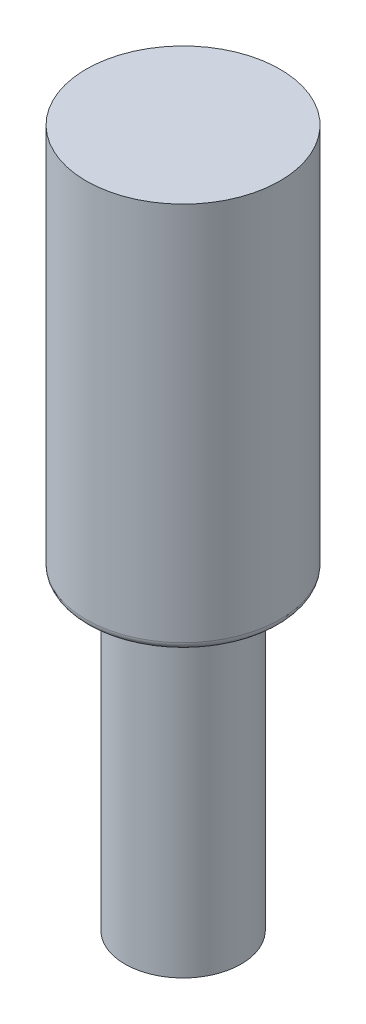
ISO-10303-21;
HEADER;
FILE_DESCRIPTION(('STEP AP214'),'2;1');
FILE_NAME('part.step','',(''),(''),'','','');
FILE_SCHEMA(('AUTOMOTIVE_DESIGN { 1 0 10303 214 1 1 1 1 }'));
ENDSEC;
DATA;
#1=APPLICATION_CONTEXT('core data for automotive mechanical design processes');
#2=APPLICATION_PROTOCOL_DEFINITION('international standard','automotive_design',2000,#1);
#3=PRODUCT_CONTEXT('',#1,'mechanical');
#4=PRODUCT('Part','Part','',(#3));
#5=PRODUCT_RELATED_PRODUCT_CATEGORY('part','',(#4));
#6=PRODUCT_DEFINITION_FORMATION('','',#4);
#7=PRODUCT_DEFINITION_CONTEXT('part definition',#1,'design');
#8=PRODUCT_DEFINITION('design','',#6,#7);
#9=PRODUCT_DEFINITION_SHAPE('','',#8);
#10=(LENGTH_UNIT() NAMED_UNIT(*) SI_UNIT(.MILLI.,.METRE.));
#11=(NAMED_UNIT(*) PLANE_ANGLE_UNIT() SI_UNIT($,.RADIAN.));
#12=(NAMED_UNIT(*) SI_UNIT($,.STERADIAN.) SOLID_ANGLE_UNIT());
#13=UNCERTAINTY_MEASURE_WITH_UNIT(LENGTH_MEASURE(1.E-05),#10,'distance_accuracy_value','');
#14=(GEOMETRIC_REPRESENTATION_CONTEXT(3) GLOBAL_UNCERTAINTY_ASSIGNED_CONTEXT((#13)) GLOBAL_UNIT_ASSIGNED_CONTEXT((#10,
#11,#12)) REPRESENTATION_CONTEXT('',''));
#15=CARTESIAN_POINT('',(0.,0.,0.));
#16=DIRECTION('',(0.,0.,1.));
#17=DIRECTION('',(1.,0.,0.));
#18=AXIS2_PLACEMENT_3D('',#15,#16,#17);
#19=CARTESIAN_POINT('',(0.,100.,0.));
#20=DIRECTION('',(0.,-1.,0.));
#21=DIRECTION('',(0.,0.,-1.));
#22=AXIS2_PLACEMENT_3D('',#19,#20,#21);
#23=CYLINDRICAL_SURFACE('',#22,25.);
#24=CARTESIAN_POINT('',(0.,2.,0.));
#25=DIRECTION('',(0.,1.,0.));
#26=DIRECTION('',(0.,0.,1.));
#27=AXIS2_PLACEMENT_3D('',#24,#25,#26);
#28=CIRCLE('',#27,25.);
#29=CARTESIAN_POINT('',(0.,2.,25.));
#30=VERTEX_POINT('',#29);
#31=EDGE_CURVE('E55',#30,#30,#28,.T.);
#32=ORIENTED_EDGE('',*,*,#31,.T.);
#33=EDGE_LOOP('',(#32));
#34=FACE_BOUND('',#33,.T.);
#35=CARTESIAN_POINT('',(0.,100.,0.));
#36=DIRECTION('',(0.,1.,0.));
#37=DIRECTION('',(0.,0.,1.));
#38=AXIS2_PLACEMENT_3D('',#35,#36,#37);
#39=CIRCLE('',#38,25.);
#40=CARTESIAN_POINT('',(0.,100.,25.));
#41=VERTEX_POINT('',#40);
#42=EDGE_CURVE('E60',#41,#41,#39,.T.);
#43=ORIENTED_EDGE('',*,*,#42,.F.);
#44=EDGE_LOOP('',(#43));
#45=FACE_BOUND('',#44,.T.);
#46=ADVANCED_FACE('F40',(#34,#45),#23,.T.);
#47=CARTESIAN_POINT('',(0.,100.,0.));
#48=DIRECTION('',(0.,1.,0.));
#49=DIRECTION('',(0.,0.,1.));
#50=AXIS2_PLACEMENT_3D('',#47,#48,#49);
#51=PLANE('',#50);
#52=ORIENTED_EDGE('',*,*,#42,.T.);
#53=EDGE_LOOP('',(#52));
#54=FACE_BOUND('',#53,.T.);
#55=ADVANCED_FACE('F80',(#54),#51,.T.);
#56=CARTESIAN_POINT('',(0.,0.,0.));
#57=DIRECTION('',(0.,1.,0.));
#58=DIRECTION('',(0.,0.,1.));
#59=AXIS2_PLACEMENT_3D('',#56,#57,#58);
#60=PLANE('',#59);
#61=CARTESIAN_POINT('',(0.,0.,0.));
#62=DIRECTION('',(0.,1.,0.));
#63=DIRECTION('',(0.,0.,1.));
#64=AXIS2_PLACEMENT_3D('',#61,#62,#63);
#65=CIRCLE('',#64,23.);
#66=CARTESIAN_POINT('',(0.,0.,23.));
#67=VERTEX_POINT('',#66);
#68=EDGE_CURVE('E42',#67,#67,#65,.F.);
#69=ORIENTED_EDGE('',*,*,#68,.T.);
#70=EDGE_LOOP('',(#69));
#71=FACE_BOUND('',#70,.T.);
#72=CARTESIAN_POINT('',(0.,0.,0.));
#73=DIRECTION('',(0.,1.,0.));
#74=DIRECTION('',(0.,0.,1.));
#75=AXIS2_PLACEMENT_3D('',#72,#73,#74);
#76=CIRCLE('',#75,17.);
#77=CARTESIAN_POINT('',(0.,0.,17.));
#78=VERTEX_POINT('',#77);
#79=EDGE_CURVE('E48',#78,#78,#76,.T.);
#80=ORIENTED_EDGE('',*,*,#79,.T.);
#81=EDGE_LOOP('',(#80));
#82=FACE_BOUND('',#81,.T.);
#83=ADVANCED_FACE('F79',(#71,#82),#60,.F.);
#84=CARTESIAN_POINT('',(0.,-80.,0.));
#85=DIRECTION('',(0.,1.,0.));
#86=DIRECTION('',(0.,0.,1.));
#87=AXIS2_PLACEMENT_3D('',#84,#85,#86);
#88=CYLINDRICAL_SURFACE('',#87,15.);
#89=CARTESIAN_POINT('',(0.,-2.,0.));
#90=DIRECTION('',(0.,1.,0.));
#91=DIRECTION('',(0.,0.,1.));
#92=AXIS2_PLACEMENT_3D('',#89,#90,#91);
#93=CIRCLE('',#92,15.);
#94=CARTESIAN_POINT('',(0.,-2.,15.));
#95=VERTEX_POINT('',#94);
#96=EDGE_CURVE('E10',#95,#95,#93,.F.);
#97=ORIENTED_EDGE('',*,*,#96,.T.);
#98=EDGE_LOOP('',(#97));
#99=FACE_BOUND('',#98,.T.);
#100=CARTESIAN_POINT('',(0.,-80.,0.));
#101=DIRECTION('',(0.,1.,0.));
#102=DIRECTION('',(0.,0.,1.));
#103=AXIS2_PLACEMENT_3D('',#100,#101,#102);
#104=CIRCLE('',#103,15.);
#105=CARTESIAN_POINT('',(0.,-80.,15.));
#106=VERTEX_POINT('',#105);
#107=EDGE_CURVE('E58',#106,#106,#104,.T.);
#108=ORIENTED_EDGE('',*,*,#107,.T.);
#109=EDGE_LOOP('',(#108));
#110=FACE_BOUND('',#109,.T.);
#111=ADVANCED_FACE('F65',(#99,#110),#88,.T.);
#112=CARTESIAN_POINT('',(0.,-80.,0.));
#113=DIRECTION('',(0.,1.,0.));
#114=DIRECTION('',(0.,0.,1.));
#115=AXIS2_PLACEMENT_3D('',#112,#113,#114);
#116=PLANE('',#115);
#117=ORIENTED_EDGE('',*,*,#107,.F.);
#118=EDGE_LOOP('',(#117));
#119=FACE_BOUND('',#118,.T.);
#120=ADVANCED_FACE('F68',(#119),#116,.F.);
#121=CARTESIAN_POINT('',(0.,2.,0.));
#122=DIRECTION('',(0.,1.,0.));
#123=DIRECTION('',(0.,0.,1.));
#124=AXIS2_PLACEMENT_3D('',#121,#122,#123);
#125=TOROIDAL_SURFACE('',#124,23.,2.);
#126=ORIENTED_EDGE('',*,*,#68,.F.);
#127=EDGE_LOOP('',(#126));
#128=FACE_BOUND('',#127,.T.);
#129=ORIENTED_EDGE('',*,*,#31,.F.);
#130=EDGE_LOOP('',(#129));
#131=FACE_BOUND('',#130,.T.);
#132=ADVANCED_FACE('F66',(#128,#131),#125,.T.);
#133=CARTESIAN_POINT('',(0.,-2.,0.));
#134=DIRECTION('',(0.,1.,0.));
#135=DIRECTION('',(0.,0.,1.));
#136=AXIS2_PLACEMENT_3D('',#133,#134,#135);
#137=TOROIDAL_SURFACE('',#136,17.,2.);
#138=ORIENTED_EDGE('',*,*,#96,.F.);
#139=EDGE_LOOP('',(#138));
#140=FACE_BOUND('',#139,.T.);
#141=ORIENTED_EDGE('',*,*,#79,.F.);
#142=EDGE_LOOP('',(#141));
#143=FACE_BOUND('',#142,.T.);
#144=ADVANCED_FACE('F39',(#140,#143),#137,.F.);
#145=CLOSED_SHELL('',(#46,#55,#83,#111,#120,#132,#144));
#146=MANIFOLD_SOLID_BREP('B2',#145);
#147=ADVANCED_BREP_SHAPE_REPRESENTATION('',(#18,#146),#14);
#148=SHAPE_DEFINITION_REPRESENTATION(#9,#147);
ENDSEC;
END-ISO-10303-21;
